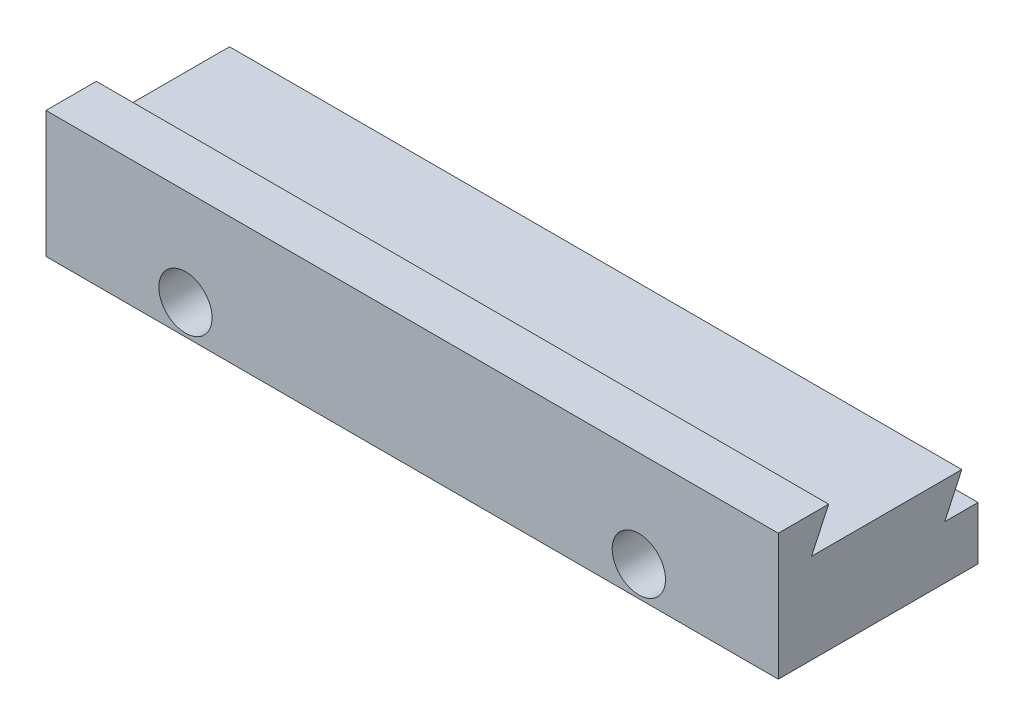
ISO-10303-21;
HEADER;
FILE_DESCRIPTION(('STEP AP214'),'2;1');
FILE_NAME('part.step','',(''),(''),'','','');
FILE_SCHEMA(('AUTOMOTIVE_DESIGN { 1 0 10303 214 1 1 1 1 }'));
ENDSEC;
DATA;
#1=APPLICATION_CONTEXT('core data for automotive mechanical design processes');
#2=APPLICATION_PROTOCOL_DEFINITION('international standard','automotive_design',2000,#1);
#3=PRODUCT_CONTEXT('',#1,'mechanical');
#4=PRODUCT('Part','Part','',(#3));
#5=PRODUCT_RELATED_PRODUCT_CATEGORY('part','',(#4));
#6=PRODUCT_DEFINITION_FORMATION('','',#4);
#7=PRODUCT_DEFINITION_CONTEXT('part definition',#1,'design');
#8=PRODUCT_DEFINITION('design','',#6,#7);
#9=PRODUCT_DEFINITION_SHAPE('','',#8);
#10=(LENGTH_UNIT() NAMED_UNIT(*) SI_UNIT(.MILLI.,.METRE.));
#11=(NAMED_UNIT(*) PLANE_ANGLE_UNIT() SI_UNIT($,.RADIAN.));
#12=(NAMED_UNIT(*) SI_UNIT($,.STERADIAN.) SOLID_ANGLE_UNIT());
#13=UNCERTAINTY_MEASURE_WITH_UNIT(LENGTH_MEASURE(1.E-05),#10,'distance_accuracy_value','');
#14=(GEOMETRIC_REPRESENTATION_CONTEXT(3) GLOBAL_UNCERTAINTY_ASSIGNED_CONTEXT((#13)) GLOBAL_UNIT_ASSIGNED_CONTEXT((#10,
#11,#12)) REPRESENTATION_CONTEXT('',''));
#15=CARTESIAN_POINT('',(0.,0.,0.));
#16=DIRECTION('',(0.,0.,1.));
#17=DIRECTION('',(1.,0.,0.));
#18=AXIS2_PLACEMENT_3D('',#15,#16,#17);
#19=CARTESIAN_POINT('',(89.0511696589856,4.50000000000001,5.939696961967));
#20=DIRECTION('',(0.,0.,-1.));
#21=DIRECTION('',(-1.,0.,0.));
#22=AXIS2_PLACEMENT_3D('',#19,#20,#21);
#23=CYLINDRICAL_SURFACE('',#22,2.09999999999999);
#24=CARTESIAN_POINT('',(89.0511696589856,4.50000000000001,-30.));
#25=DIRECTION('',(0.,0.,-1.));
#26=DIRECTION('',(1.,0.,0.));
#27=AXIS2_PLACEMENT_3D('',#24,#25,#26);
#28=CIRCLE('',#27,2.09999999999999);
#29=CARTESIAN_POINT('',(91.1511696589856,4.50000000000001,-30.));
#30=VERTEX_POINT('',#29);
#31=EDGE_CURVE('E176',#30,#30,#28,.T.);
#32=ORIENTED_EDGE('',*,*,#31,.T.);
#33=EDGE_LOOP('',(#32));
#34=FACE_BOUND('',#33,.T.);
#35=CARTESIAN_POINT('',(89.0511696589856,4.50000000000001,-20.));
#36=DIRECTION('',(0.,0.,1.));
#37=DIRECTION('',(1.,0.,0.));
#38=AXIS2_PLACEMENT_3D('',#35,#36,#37);
#39=CIRCLE('',#38,2.09999999999999);
#40=CARTESIAN_POINT('',(91.1511696589856,4.50000000000001,-20.));
#41=VERTEX_POINT('',#40);
#42=EDGE_CURVE('E49',#41,#41,#39,.F.);
#43=ORIENTED_EDGE('',*,*,#42,.F.);
#44=EDGE_LOOP('',(#43));
#45=FACE_BOUND('',#44,.T.);
#46=ADVANCED_FACE('F45',(#34,#45),#23,.F.);
#47=CARTESIAN_POINT('',(20.9488303410144,4.50000000000001,5.939696961967));
#48=DIRECTION('',(0.,0.,-1.));
#49=DIRECTION('',(-1.,0.,0.));
#50=AXIS2_PLACEMENT_3D('',#47,#48,#49);
#51=CYLINDRICAL_SURFACE('',#50,2.1);
#52=CARTESIAN_POINT('',(20.9488303410144,4.50000000000001,-30.));
#53=DIRECTION('',(0.,0.,-1.));
#54=DIRECTION('',(-1.,0.,0.));
#55=AXIS2_PLACEMENT_3D('',#52,#53,#54);
#56=CIRCLE('',#55,2.1);
#57=CARTESIAN_POINT('',(18.8488303410144,4.50000000000001,-30.));
#58=VERTEX_POINT('',#57);
#59=EDGE_CURVE('E148',#58,#58,#56,.T.);
#60=ORIENTED_EDGE('',*,*,#59,.T.);
#61=EDGE_LOOP('',(#60));
#62=FACE_BOUND('',#61,.T.);
#63=CARTESIAN_POINT('',(20.9488303410144,4.50000000000001,-20.));
#64=DIRECTION('',(0.,0.,1.));
#65=DIRECTION('',(1.,0.,0.));
#66=AXIS2_PLACEMENT_3D('',#63,#64,#65);
#67=CIRCLE('',#66,2.1);
#68=CARTESIAN_POINT('',(23.0488303410144,4.50000000000001,-20.));
#69=VERTEX_POINT('',#68);
#70=EDGE_CURVE('E170',#69,#69,#67,.F.);
#71=ORIENTED_EDGE('',*,*,#70,.F.);
#72=EDGE_LOOP('',(#71));
#73=FACE_BOUND('',#72,.T.);
#74=ADVANCED_FACE('F233',(#62,#73),#51,.F.);
#75=CARTESIAN_POINT('',(110.,0.,-30.));
#76=DIRECTION('',(0.,1.,0.));
#77=DIRECTION('',(0.,0.,1.));
#78=AXIS2_PLACEMENT_3D('',#75,#76,#77);
#79=PLANE('',#78);
#80=DIRECTION('',(0.,0.,-1.));
#81=VECTOR('',#80,1.);
#82=CARTESIAN_POINT('',(0.,0.,-30.));
#83=LINE('',#82,#81);
#84=CARTESIAN_POINT('',(0.,0.,0.));
#85=VERTEX_POINT('',#84);
#86=CARTESIAN_POINT('',(0.,0.,-30.));
#87=VERTEX_POINT('',#86);
#88=EDGE_CURVE('E144',#85,#87,#83,.T.);
#89=ORIENTED_EDGE('',*,*,#88,.T.);
#90=DIRECTION('',(-1.,0.,0.));
#91=VECTOR('',#90,1.);
#92=CARTESIAN_POINT('',(110.,0.,-30.));
#93=LINE('',#92,#91);
#94=CARTESIAN_POINT('',(110.,0.,-30.));
#95=VERTEX_POINT('',#94);
#96=EDGE_CURVE('E12',#95,#87,#93,.T.);
#97=ORIENTED_EDGE('',*,*,#96,.F.);
#98=DIRECTION('',(0.,0.,-1.));
#99=VECTOR('',#98,1.);
#100=CARTESIAN_POINT('',(110.,0.,-30.));
#101=LINE('',#100,#99);
#102=CARTESIAN_POINT('',(110.,0.,0.));
#103=VERTEX_POINT('',#102);
#104=EDGE_CURVE('E159',#103,#95,#101,.T.);
#105=ORIENTED_EDGE('',*,*,#104,.F.);
#106=DIRECTION('',(-1.,0.,0.));
#107=VECTOR('',#106,1.);
#108=CARTESIAN_POINT('',(110.,0.,0.));
#109=LINE('',#108,#107);
#110=EDGE_CURVE('E140',#103,#85,#109,.T.);
#111=ORIENTED_EDGE('',*,*,#110,.T.);
#112=EDGE_LOOP('',(#89,#97,#105,#111));
#113=FACE_BOUND('',#112,.T.);
#114=ADVANCED_FACE('F47',(#113),#79,.F.);
#115=CARTESIAN_POINT('',(110.,8.00000000000001,-30.));
#116=DIRECTION('',(0.,0.,1.));
#117=DIRECTION('',(1.,0.,0.));
#118=AXIS2_PLACEMENT_3D('',#115,#116,#117);
#119=PLANE('',#118);
#120=ORIENTED_EDGE('',*,*,#59,.F.);
#121=EDGE_LOOP('',(#120));
#122=FACE_BOUND('',#121,.T.);
#123=ORIENTED_EDGE('',*,*,#31,.F.);
#124=EDGE_LOOP('',(#123));
#125=FACE_BOUND('',#124,.T.);
#126=DIRECTION('',(0.,1.,0.));
#127=VECTOR('',#126,1.);
#128=CARTESIAN_POINT('',(0.,8.00000000000001,-30.));
#129=LINE('',#128,#127);
#130=CARTESIAN_POINT('',(0.,8.00000000000001,-30.));
#131=VERTEX_POINT('',#130);
#132=EDGE_CURVE('E147',#87,#131,#129,.T.);
#133=ORIENTED_EDGE('',*,*,#132,.T.);
#134=DIRECTION('',(-1.,0.,0.));
#135=VECTOR('',#134,1.);
#136=CARTESIAN_POINT('',(110.,8.00000000000001,-30.));
#137=LINE('',#136,#135);
#138=CARTESIAN_POINT('',(110.,8.00000000000001,-30.));
#139=VERTEX_POINT('',#138);
#140=EDGE_CURVE('E55',#139,#131,#137,.T.);
#141=ORIENTED_EDGE('',*,*,#140,.F.);
#142=DIRECTION('',(0.,1.,0.));
#143=VECTOR('',#142,1.);
#144=CARTESIAN_POINT('',(110.,8.00000000000001,-30.));
#145=LINE('',#144,#143);
#146=EDGE_CURVE('E107',#95,#139,#145,.T.);
#147=ORIENTED_EDGE('',*,*,#146,.F.);
#148=ORIENTED_EDGE('',*,*,#96,.T.);
#149=EDGE_LOOP('',(#133,#141,#147,#148));
#150=FACE_BOUND('',#149,.T.);
#151=ADVANCED_FACE('F346',(#122,#125,#150),#119,.F.);
#152=CARTESIAN_POINT('',(110.,8.00000000000001,-25.));
#153=DIRECTION('',(0.,-1.,0.));
#154=DIRECTION('',(0.,0.,-1.));
#155=AXIS2_PLACEMENT_3D('',#152,#153,#154);
#156=PLANE('',#155);
#157=DIRECTION('',(0.,0.,1.));
#158=VECTOR('',#157,1.);
#159=CARTESIAN_POINT('',(0.,8.00000000000001,-25.));
#160=LINE('',#159,#158);
#161=CARTESIAN_POINT('',(0.,8.00000000000001,-25.));
#162=VERTEX_POINT('',#161);
#163=EDGE_CURVE('E150',#131,#162,#160,.T.);
#164=ORIENTED_EDGE('',*,*,#163,.T.);
#165=DIRECTION('',(-1.,0.,0.));
#166=VECTOR('',#165,1.);
#167=CARTESIAN_POINT('',(110.,8.00000000000001,-25.));
#168=LINE('',#167,#166);
#169=CARTESIAN_POINT('',(110.,8.00000000000001,-25.));
#170=VERTEX_POINT('',#169);
#171=EDGE_CURVE('E166',#170,#162,#168,.T.);
#172=ORIENTED_EDGE('',*,*,#171,.F.);
#173=DIRECTION('',(0.,0.,1.));
#174=VECTOR('',#173,1.);
#175=CARTESIAN_POINT('',(110.,8.00000000000001,-25.));
#176=LINE('',#175,#174);
#177=EDGE_CURVE('E197',#139,#170,#176,.T.);
#178=ORIENTED_EDGE('',*,*,#177,.F.);
#179=ORIENTED_EDGE('',*,*,#140,.T.);
#180=EDGE_LOOP('',(#164,#172,#178,#179));
#181=FACE_BOUND('',#180,.T.);
#182=ADVANCED_FACE('F337',(#181),#156,.F.);
#183=CARTESIAN_POINT('',(110.,13.5,-27.5646921198525));
#184=DIRECTION('',(0.,0.422618261740704,0.906307787036648));
#185=DIRECTION('',(0.,-0.906307787036648,0.422618261740704));
#186=AXIS2_PLACEMENT_3D('',#183,#184,#185);
#187=PLANE('',#186);
#188=DIRECTION('',(0.,0.906307787036648,-0.422618261740704));
#189=VECTOR('',#188,1.);
#190=CARTESIAN_POINT('',(0.,13.5,-27.5646921198525));
#191=LINE('',#190,#189);
#192=CARTESIAN_POINT('',(0.,13.5,-27.5646921198525));
#193=VERTEX_POINT('',#192);
#194=EDGE_CURVE('E152',#162,#193,#191,.T.);
#195=ORIENTED_EDGE('',*,*,#194,.T.);
#196=DIRECTION('',(-1.,0.,0.));
#197=VECTOR('',#196,1.);
#198=CARTESIAN_POINT('',(110.,13.5,-27.5646921198525));
#199=LINE('',#198,#197);
#200=CARTESIAN_POINT('',(110.,13.5,-27.5646921198525));
#201=VERTEX_POINT('',#200);
#202=EDGE_CURVE('E163',#201,#193,#199,.T.);
#203=ORIENTED_EDGE('',*,*,#202,.F.);
#204=DIRECTION('',(0.,0.906307787036648,-0.422618261740704));
#205=VECTOR('',#204,1.);
#206=CARTESIAN_POINT('',(110.,13.5,-27.5646921198525));
#207=LINE('',#206,#205);
#208=EDGE_CURVE('E199',#170,#201,#207,.T.);
#209=ORIENTED_EDGE('',*,*,#208,.F.);
#210=ORIENTED_EDGE('',*,*,#171,.T.);
#211=EDGE_LOOP('',(#195,#203,#209,#210));
#212=FACE_BOUND('',#211,.T.);
#213=ADVANCED_FACE('F205',(#212),#187,.F.);
#214=CARTESIAN_POINT('',(110.,13.5,-5.));
#215=DIRECTION('',(0.,-1.,0.));
#216=DIRECTION('',(0.,0.,-1.));
#217=AXIS2_PLACEMENT_3D('',#214,#215,#216);
#218=PLANE('',#217);
#219=DIRECTION('',(0.,0.,1.));
#220=VECTOR('',#219,1.);
#221=CARTESIAN_POINT('',(0.,13.5,-5.));
#222=LINE('',#221,#220);
#223=CARTESIAN_POINT('',(0.,13.5,-5.));
#224=VERTEX_POINT('',#223);
#225=EDGE_CURVE('E154',#193,#224,#222,.T.);
#226=ORIENTED_EDGE('',*,*,#225,.T.);
#227=DIRECTION('',(-1.,0.,0.));
#228=VECTOR('',#227,1.);
#229=CARTESIAN_POINT('',(110.,13.5,-5.));
#230=LINE('',#229,#228);
#231=CARTESIAN_POINT('',(110.,13.5,-5.));
#232=VERTEX_POINT('',#231);
#233=EDGE_CURVE('E135',#232,#224,#230,.T.);
#234=ORIENTED_EDGE('',*,*,#233,.F.);
#235=DIRECTION('',(0.,0.,1.));
#236=VECTOR('',#235,1.);
#237=CARTESIAN_POINT('',(110.,13.5,-5.));
#238=LINE('',#237,#236);
#239=EDGE_CURVE('E126',#201,#232,#238,.T.);
#240=ORIENTED_EDGE('',*,*,#239,.F.);
#241=ORIENTED_EDGE('',*,*,#202,.T.);
#242=EDGE_LOOP('',(#226,#234,#240,#241));
#243=FACE_BOUND('',#242,.T.);
#244=ADVANCED_FACE('F209',(#243),#218,.F.);
#245=CARTESIAN_POINT('',(110.,19.,-7.56469211985252));
#246=DIRECTION('',(0.,0.422618261740704,0.906307787036648));
#247=DIRECTION('',(0.,-0.906307787036648,0.422618261740704));
#248=AXIS2_PLACEMENT_3D('',#245,#246,#247);
#249=PLANE('',#248);
#250=DIRECTION('',(0.,0.906307787036648,-0.422618261740704));
#251=VECTOR('',#250,1.);
#252=CARTESIAN_POINT('',(0.,19.,-7.56469211985252));
#253=LINE('',#252,#251);
#254=CARTESIAN_POINT('',(0.,19.,-7.56469211985252));
#255=VERTEX_POINT('',#254);
#256=EDGE_CURVE('E134',#224,#255,#253,.T.);
#257=ORIENTED_EDGE('',*,*,#256,.T.);
#258=DIRECTION('',(-1.,0.,0.));
#259=VECTOR('',#258,1.);
#260=CARTESIAN_POINT('',(110.,19.,-7.56469211985252));
#261=LINE('',#260,#259);
#262=CARTESIAN_POINT('',(110.,19.,-7.56469211985252));
#263=VERTEX_POINT('',#262);
#264=EDGE_CURVE('E131',#263,#255,#261,.T.);
#265=ORIENTED_EDGE('',*,*,#264,.F.);
#266=DIRECTION('',(0.,0.906307787036648,-0.422618261740704));
#267=VECTOR('',#266,1.);
#268=CARTESIAN_POINT('',(110.,19.,-7.56469211985252));
#269=LINE('',#268,#267);
#270=EDGE_CURVE('E120',#232,#263,#269,.T.);
#271=ORIENTED_EDGE('',*,*,#270,.F.);
#272=ORIENTED_EDGE('',*,*,#233,.T.);
#273=EDGE_LOOP('',(#257,#265,#271,#272));
#274=FACE_BOUND('',#273,.T.);
#275=ADVANCED_FACE('F132',(#274),#249,.F.);
#276=CARTESIAN_POINT('',(110.,19.,0.));
#277=DIRECTION('',(0.,-1.,0.));
#278=DIRECTION('',(0.,0.,-1.));
#279=AXIS2_PLACEMENT_3D('',#276,#277,#278);
#280=PLANE('',#279);
#281=DIRECTION('',(0.,0.,1.));
#282=VECTOR('',#281,1.);
#283=CARTESIAN_POINT('',(0.,19.,0.));
#284=LINE('',#283,#282);
#285=CARTESIAN_POINT('',(0.,19.,0.));
#286=VERTEX_POINT('',#285);
#287=EDGE_CURVE('E93',#255,#286,#284,.T.);
#288=ORIENTED_EDGE('',*,*,#287,.T.);
#289=DIRECTION('',(-1.,0.,0.));
#290=VECTOR('',#289,1.);
#291=CARTESIAN_POINT('',(110.,19.,0.));
#292=LINE('',#291,#290);
#293=CARTESIAN_POINT('',(110.,19.,0.));
#294=VERTEX_POINT('',#293);
#295=EDGE_CURVE('E136',#294,#286,#292,.T.);
#296=ORIENTED_EDGE('',*,*,#295,.F.);
#297=DIRECTION('',(0.,0.,1.));
#298=VECTOR('',#297,1.);
#299=CARTESIAN_POINT('',(110.,19.,0.));
#300=LINE('',#299,#298);
#301=EDGE_CURVE('E124',#263,#294,#300,.T.);
#302=ORIENTED_EDGE('',*,*,#301,.F.);
#303=ORIENTED_EDGE('',*,*,#264,.T.);
#304=EDGE_LOOP('',(#288,#296,#302,#303));
#305=FACE_BOUND('',#304,.T.);
#306=ADVANCED_FACE('F138',(#305),#280,.F.);
#307=CARTESIAN_POINT('',(110.,0.,0.));
#308=DIRECTION('',(0.,0.,-1.));
#309=DIRECTION('',(-1.,0.,0.));
#310=AXIS2_PLACEMENT_3D('',#307,#308,#309);
#311=PLANE('',#310);
#312=CARTESIAN_POINT('',(20.9488303410144,4.50000000000001,0.));
#313=DIRECTION('',(0.,0.,1.));
#314=DIRECTION('',(1.,0.,0.));
#315=AXIS2_PLACEMENT_3D('',#312,#313,#314);
#316=CIRCLE('',#315,4.);
#317=CARTESIAN_POINT('',(24.9488303410144,4.50000000000001,0.));
#318=VERTEX_POINT('',#317);
#319=EDGE_CURVE('E178',#318,#318,#316,.T.);
#320=ORIENTED_EDGE('',*,*,#319,.F.);
#321=EDGE_LOOP('',(#320));
#322=FACE_BOUND('',#321,.T.);
#323=CARTESIAN_POINT('',(89.0511696589856,4.50000000000001,0.));
#324=DIRECTION('',(0.,0.,1.));
#325=DIRECTION('',(1.,0.,0.));
#326=AXIS2_PLACEMENT_3D('',#323,#324,#325);
#327=CIRCLE('',#326,4.00000000000001);
#328=CARTESIAN_POINT('',(93.0511696589856,4.50000000000001,0.));
#329=VERTEX_POINT('',#328);
#330=EDGE_CURVE('E186',#329,#329,#327,.T.);
#331=ORIENTED_EDGE('',*,*,#330,.F.);
#332=EDGE_LOOP('',(#331));
#333=FACE_BOUND('',#332,.T.);
#334=DIRECTION('',(0.,-1.,0.));
#335=VECTOR('',#334,1.);
#336=CARTESIAN_POINT('',(0.,0.,0.));
#337=LINE('',#336,#335);
#338=EDGE_CURVE('E99',#286,#85,#337,.T.);
#339=ORIENTED_EDGE('',*,*,#338,.T.);
#340=ORIENTED_EDGE('',*,*,#110,.F.);
#341=DIRECTION('',(0.,-1.,0.));
#342=VECTOR('',#341,1.);
#343=CARTESIAN_POINT('',(110.,0.,0.));
#344=LINE('',#343,#342);
#345=EDGE_CURVE('E64',#294,#103,#344,.T.);
#346=ORIENTED_EDGE('',*,*,#345,.F.);
#347=ORIENTED_EDGE('',*,*,#295,.T.);
#348=EDGE_LOOP('',(#339,#340,#346,#347));
#349=FACE_BOUND('',#348,.T.);
#350=ADVANCED_FACE('F217',(#322,#333,#349),#311,.F.);
#351=CARTESIAN_POINT('',(110.,0.,0.));
#352=DIRECTION('',(-1.,0.,0.));
#353=DIRECTION('',(0.,0.,1.));
#354=AXIS2_PLACEMENT_3D('',#351,#352,#353);
#355=PLANE('',#354);
#356=ORIENTED_EDGE('',*,*,#104,.T.);
#357=ORIENTED_EDGE('',*,*,#146,.T.);
#358=ORIENTED_EDGE('',*,*,#177,.T.);
#359=ORIENTED_EDGE('',*,*,#208,.T.);
#360=ORIENTED_EDGE('',*,*,#239,.T.);
#361=ORIENTED_EDGE('',*,*,#270,.T.);
#362=ORIENTED_EDGE('',*,*,#301,.T.);
#363=ORIENTED_EDGE('',*,*,#345,.T.);
#364=EDGE_LOOP('',(#356,#357,#358,#359,#360,#361,#362,#363));
#365=FACE_BOUND('',#364,.T.);
#366=ADVANCED_FACE('F122',(#365),#355,.F.);
#367=CARTESIAN_POINT('',(0.,0.,0.));
#368=DIRECTION('',(-1.,0.,0.));
#369=DIRECTION('',(0.,0.,1.));
#370=AXIS2_PLACEMENT_3D('',#367,#368,#369);
#371=PLANE('',#370);
#372=ORIENTED_EDGE('',*,*,#88,.F.);
#373=ORIENTED_EDGE('',*,*,#338,.F.);
#374=ORIENTED_EDGE('',*,*,#287,.F.);
#375=ORIENTED_EDGE('',*,*,#256,.F.);
#376=ORIENTED_EDGE('',*,*,#225,.F.);
#377=ORIENTED_EDGE('',*,*,#194,.F.);
#378=ORIENTED_EDGE('',*,*,#163,.F.);
#379=ORIENTED_EDGE('',*,*,#132,.F.);
#380=EDGE_LOOP('',(#372,#373,#374,#375,#376,#377,#378,#379));
#381=FACE_BOUND('',#380,.T.);
#382=ADVANCED_FACE('F212',(#381),#371,.T.);
#383=CARTESIAN_POINT('',(110.,8.00000000000001,-20.));
#384=DIRECTION('',(0.,0.,1.));
#385=DIRECTION('',(1.,0.,0.));
#386=AXIS2_PLACEMENT_3D('',#383,#384,#385);
#387=PLANE('',#386);
#388=CARTESIAN_POINT('',(20.9488303410144,4.50000000000001,-20.));
#389=DIRECTION('',(0.,0.,1.));
#390=DIRECTION('',(1.,0.,0.));
#391=AXIS2_PLACEMENT_3D('',#388,#389,#390);
#392=CIRCLE('',#391,4.);
#393=CARTESIAN_POINT('',(24.9488303410144,4.50000000000001,-20.));
#394=VERTEX_POINT('',#393);
#395=EDGE_CURVE('E172',#394,#394,#392,.F.);
#396=ORIENTED_EDGE('',*,*,#395,.F.);
#397=EDGE_LOOP('',(#396));
#398=FACE_BOUND('',#397,.T.);
#399=ORIENTED_EDGE('',*,*,#70,.T.);
#400=EDGE_LOOP('',(#399));
#401=FACE_BOUND('',#400,.T.);
#402=ADVANCED_FACE('F244',(#398,#401),#387,.T.);
#403=CARTESIAN_POINT('',(20.9488303410144,4.50000000000001,-41.3137084989848));
#404=DIRECTION('',(0.,0.,1.));
#405=DIRECTION('',(1.,0.,0.));
#406=AXIS2_PLACEMENT_3D('',#403,#404,#405);
#407=CYLINDRICAL_SURFACE('',#406,4.);
#408=ORIENTED_EDGE('',*,*,#395,.T.);
#409=EDGE_LOOP('',(#408));
#410=FACE_BOUND('',#409,.T.);
#411=ORIENTED_EDGE('',*,*,#319,.T.);
#412=EDGE_LOOP('',(#411));
#413=FACE_BOUND('',#412,.T.);
#414=ADVANCED_FACE('F247',(#410,#413),#407,.F.);
#415=CARTESIAN_POINT('',(110.,8.00000000000001,-20.));
#416=DIRECTION('',(0.,0.,1.));
#417=DIRECTION('',(1.,0.,0.));
#418=AXIS2_PLACEMENT_3D('',#415,#416,#417);
#419=PLANE('',#418);
#420=CARTESIAN_POINT('',(89.0511696589856,4.50000000000001,-20.));
#421=DIRECTION('',(0.,0.,1.));
#422=DIRECTION('',(1.,0.,0.));
#423=AXIS2_PLACEMENT_3D('',#420,#421,#422);
#424=CIRCLE('',#423,4.00000000000001);
#425=CARTESIAN_POINT('',(93.0511696589856,4.50000000000001,-20.));
#426=VERTEX_POINT('',#425);
#427=EDGE_CURVE('E183',#426,#426,#424,.F.);
#428=ORIENTED_EDGE('',*,*,#427,.F.);
#429=EDGE_LOOP('',(#428));
#430=FACE_BOUND('',#429,.T.);
#431=ORIENTED_EDGE('',*,*,#42,.T.);
#432=EDGE_LOOP('',(#431));
#433=FACE_BOUND('',#432,.T.);
#434=ADVANCED_FACE('F253',(#430,#433),#419,.T.);
#435=CARTESIAN_POINT('',(89.0511696589856,4.50000000000001,-41.3137084989848));
#436=DIRECTION('',(0.,0.,1.));
#437=DIRECTION('',(1.,0.,0.));
#438=AXIS2_PLACEMENT_3D('',#435,#436,#437);
#439=CYLINDRICAL_SURFACE('',#438,4.00000000000001);
#440=ORIENTED_EDGE('',*,*,#427,.T.);
#441=EDGE_LOOP('',(#440));
#442=FACE_BOUND('',#441,.T.);
#443=ORIENTED_EDGE('',*,*,#330,.T.);
#444=EDGE_LOOP('',(#443));
#445=FACE_BOUND('',#444,.T.);
#446=ADVANCED_FACE('F257',(#442,#445),#439,.F.);
#447=CLOSED_SHELL('',(#46,#74,#114,#151,#182,#213,#244,#275,#306,#350,#366,#382,#402,#414,#434,#446));
#448=MANIFOLD_SOLID_BREP('B2',#447);
#449=ADVANCED_BREP_SHAPE_REPRESENTATION('',(#18,#448),#14);
#450=SHAPE_DEFINITION_REPRESENTATION(#9,#449);
ENDSEC;
END-ISO-10303-21;
